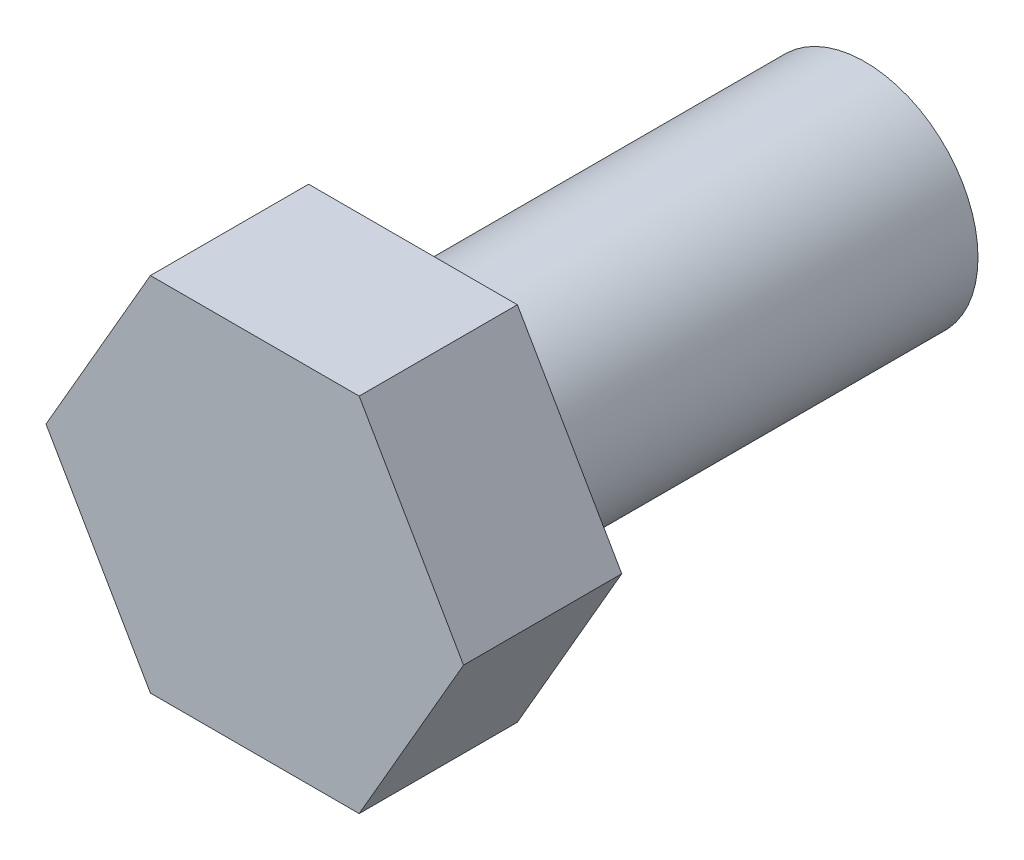
ISO-10303-21;
HEADER;
FILE_DESCRIPTION(('STEP AP214'),'2;1');
FILE_NAME('part.step','',(''),(''),'','','');
FILE_SCHEMA(('AUTOMOTIVE_DESIGN { 1 0 10303 214 1 1 1 1 }'));
ENDSEC;
DATA;
#1=APPLICATION_CONTEXT('core data for automotive mechanical design processes');
#2=APPLICATION_PROTOCOL_DEFINITION('international standard','automotive_design',2000,#1);
#3=PRODUCT_CONTEXT('',#1,'mechanical');
#4=PRODUCT('Part','Part','',(#3));
#5=PRODUCT_RELATED_PRODUCT_CATEGORY('part','',(#4));
#6=PRODUCT_DEFINITION_FORMATION('','',#4);
#7=PRODUCT_DEFINITION_CONTEXT('part definition',#1,'design');
#8=PRODUCT_DEFINITION('design','',#6,#7);
#9=PRODUCT_DEFINITION_SHAPE('','',#8);
#10=(LENGTH_UNIT() NAMED_UNIT(*) SI_UNIT(.MILLI.,.METRE.));
#11=(NAMED_UNIT(*) PLANE_ANGLE_UNIT() SI_UNIT($,.RADIAN.));
#12=(NAMED_UNIT(*) SI_UNIT($,.STERADIAN.) SOLID_ANGLE_UNIT());
#13=UNCERTAINTY_MEASURE_WITH_UNIT(LENGTH_MEASURE(1.E-05),#10,'distance_accuracy_value','');
#14=(GEOMETRIC_REPRESENTATION_CONTEXT(3) GLOBAL_UNCERTAINTY_ASSIGNED_CONTEXT((#13)) GLOBAL_UNIT_ASSIGNED_CONTEXT((#10,
#11,#12)) REPRESENTATION_CONTEXT('',''));
#15=CARTESIAN_POINT('',(0.,0.,0.));
#16=DIRECTION('',(0.,0.,1.));
#17=DIRECTION('',(1.,0.,0.));
#18=AXIS2_PLACEMENT_3D('',#15,#16,#17);
#19=CARTESIAN_POINT('',(0.,0.,-10.));
#20=DIRECTION('',(0.,0.,1.));
#21=DIRECTION('',(1.,0.,0.));
#22=AXIS2_PLACEMENT_3D('',#19,#20,#21);
#23=CYLINDRICAL_SURFACE('',#22,2.5);
#24=CARTESIAN_POINT('',(0.,0.,-10.));
#25=DIRECTION('',(0.,0.,1.));
#26=DIRECTION('',(1.,0.,0.));
#27=AXIS2_PLACEMENT_3D('',#24,#25,#26);
#28=CIRCLE('',#27,2.5);
#29=CARTESIAN_POINT('',(2.5,0.,-10.));
#30=VERTEX_POINT('',#29);
#31=EDGE_CURVE('E11',#30,#30,#28,.T.);
#32=ORIENTED_EDGE('',*,*,#31,.T.);
#33=EDGE_LOOP('',(#32));
#34=FACE_BOUND('',#33,.T.);
#35=CARTESIAN_POINT('',(0.,0.,0.));
#36=DIRECTION('',(0.,0.,1.));
#37=DIRECTION('',(1.,0.,0.));
#38=AXIS2_PLACEMENT_3D('',#35,#36,#37);
#39=CIRCLE('',#38,2.5);
#40=CARTESIAN_POINT('',(2.5,0.,0.));
#41=VERTEX_POINT('',#40);
#42=EDGE_CURVE('E39',#41,#41,#39,.T.);
#43=ORIENTED_EDGE('',*,*,#42,.F.);
#44=EDGE_LOOP('',(#43));
#45=FACE_BOUND('',#44,.T.);
#46=ADVANCED_FACE('F36',(#34,#45),#23,.T.);
#47=CARTESIAN_POINT('',(0.,0.,-10.));
#48=DIRECTION('',(0.,0.,1.));
#49=DIRECTION('',(1.,0.,0.));
#50=AXIS2_PLACEMENT_3D('',#47,#48,#49);
#51=PLANE('',#50);
#52=ORIENTED_EDGE('',*,*,#31,.F.);
#53=EDGE_LOOP('',(#52));
#54=FACE_BOUND('',#53,.T.);
#55=ADVANCED_FACE('F147',(#54),#51,.F.);
#56=CARTESIAN_POINT('',(2.3094010767585,4.,3.5));
#57=DIRECTION('',(0.,-1.,0.));
#58=DIRECTION('',(1.,0.,0.));
#59=AXIS2_PLACEMENT_3D('',#56,#57,#58);
#60=PLANE('',#59);
#61=DIRECTION('',(-1.,0.,0.));
#62=VECTOR('',#61,1.);
#63=CARTESIAN_POINT('',(2.3094010767585,4.,0.));
#64=LINE('',#63,#62);
#65=CARTESIAN_POINT('',(2.3094010767585,4.,0.));
#66=VERTEX_POINT('',#65);
#67=CARTESIAN_POINT('',(-2.3094010767585,4.,0.));
#68=VERTEX_POINT('',#67);
#69=EDGE_CURVE('E121',#66,#68,#64,.T.);
#70=ORIENTED_EDGE('',*,*,#69,.T.);
#71=DIRECTION('',(0.,0.,-1.));
#72=VECTOR('',#71,1.);
#73=CARTESIAN_POINT('',(-2.3094010767585,4.,3.5));
#74=LINE('',#73,#72);
#75=CARTESIAN_POINT('',(-2.3094010767585,4.,3.5));
#76=VERTEX_POINT('',#75);
#77=EDGE_CURVE('E138',#76,#68,#74,.T.);
#78=ORIENTED_EDGE('',*,*,#77,.F.);
#79=DIRECTION('',(-1.,0.,0.));
#80=VECTOR('',#79,1.);
#81=CARTESIAN_POINT('',(2.3094010767585,4.,3.5));
#82=LINE('',#81,#80);
#83=CARTESIAN_POINT('',(2.3094010767585,4.,3.5));
#84=VERTEX_POINT('',#83);
#85=EDGE_CURVE('E131',#84,#76,#82,.T.);
#86=ORIENTED_EDGE('',*,*,#85,.F.);
#87=DIRECTION('',(0.,0.,-1.));
#88=VECTOR('',#87,1.);
#89=CARTESIAN_POINT('',(2.3094010767585,4.,3.5));
#90=LINE('',#89,#88);
#91=EDGE_CURVE('E117',#84,#66,#90,.T.);
#92=ORIENTED_EDGE('',*,*,#91,.T.);
#93=EDGE_LOOP('',(#70,#78,#86,#92));
#94=FACE_BOUND('',#93,.T.);
#95=ADVANCED_FACE('F152',(#94),#60,.F.);
#96=CARTESIAN_POINT('',(-2.3094010767585,4.,3.5));
#97=DIRECTION('',(0.866025403784439,-0.5,0.));
#98=DIRECTION('',(0.5,0.866025403784439,0.));
#99=AXIS2_PLACEMENT_3D('',#96,#97,#98);
#100=PLANE('',#99);
#101=DIRECTION('',(-0.5,-0.866025403784439,0.));
#102=VECTOR('',#101,1.);
#103=CARTESIAN_POINT('',(-2.3094010767585,4.,0.));
#104=LINE('',#103,#102);
#105=CARTESIAN_POINT('',(-4.61880215351701,0.,0.));
#106=VERTEX_POINT('',#105);
#107=EDGE_CURVE('E124',#68,#106,#104,.T.);
#108=ORIENTED_EDGE('',*,*,#107,.T.);
#109=DIRECTION('',(0.,0.,-1.));
#110=VECTOR('',#109,1.);
#111=CARTESIAN_POINT('',(-4.61880215351701,0.,3.5));
#112=LINE('',#111,#110);
#113=CARTESIAN_POINT('',(-4.61880215351701,0.,3.5));
#114=VERTEX_POINT('',#113);
#115=EDGE_CURVE('E135',#114,#106,#112,.T.);
#116=ORIENTED_EDGE('',*,*,#115,.F.);
#117=DIRECTION('',(-0.5,-0.866025403784439,0.));
#118=VECTOR('',#117,1.);
#119=CARTESIAN_POINT('',(-2.3094010767585,4.,3.5));
#120=LINE('',#119,#118);
#121=EDGE_CURVE('E90',#76,#114,#120,.T.);
#122=ORIENTED_EDGE('',*,*,#121,.F.);
#123=ORIENTED_EDGE('',*,*,#77,.T.);
#124=EDGE_LOOP('',(#108,#116,#122,#123));
#125=FACE_BOUND('',#124,.T.);
#126=ADVANCED_FACE('F158',(#125),#100,.F.);
#127=CARTESIAN_POINT('',(-4.61880215351701,0.,3.5));
#128=DIRECTION('',(0.866025403784439,0.5,0.));
#129=DIRECTION('',(-0.5,0.866025403784439,0.));
#130=AXIS2_PLACEMENT_3D('',#127,#128,#129);
#131=PLANE('',#130);
#132=DIRECTION('',(0.5,-0.866025403784439,0.));
#133=VECTOR('',#132,1.);
#134=CARTESIAN_POINT('',(-4.61880215351701,0.,0.));
#135=LINE('',#134,#133);
#136=CARTESIAN_POINT('',(-2.30940107675851,-4.,0.));
#137=VERTEX_POINT('',#136);
#138=EDGE_CURVE('E126',#106,#137,#135,.T.);
#139=ORIENTED_EDGE('',*,*,#138,.T.);
#140=DIRECTION('',(0.,0.,-1.));
#141=VECTOR('',#140,1.);
#142=CARTESIAN_POINT('',(-2.30940107675851,-4.,3.5));
#143=LINE('',#142,#141);
#144=CARTESIAN_POINT('',(-2.30940107675851,-4.,3.5));
#145=VERTEX_POINT('',#144);
#146=EDGE_CURVE('E112',#145,#137,#143,.T.);
#147=ORIENTED_EDGE('',*,*,#146,.F.);
#148=DIRECTION('',(0.5,-0.866025403784439,0.));
#149=VECTOR('',#148,1.);
#150=CARTESIAN_POINT('',(-4.61880215351701,0.,3.5));
#151=LINE('',#150,#149);
#152=EDGE_CURVE('E103',#114,#145,#151,.T.);
#153=ORIENTED_EDGE('',*,*,#152,.F.);
#154=ORIENTED_EDGE('',*,*,#115,.T.);
#155=EDGE_LOOP('',(#139,#147,#153,#154));
#156=FACE_BOUND('',#155,.T.);
#157=ADVANCED_FACE('F164',(#156),#131,.F.);
#158=CARTESIAN_POINT('',(-2.30940107675851,-4.,3.5));
#159=DIRECTION('',(0.,1.,0.));
#160=DIRECTION('',(0.,0.,1.));
#161=AXIS2_PLACEMENT_3D('',#158,#159,#160);
#162=PLANE('',#161);
#163=DIRECTION('',(1.,0.,0.));
#164=VECTOR('',#163,1.);
#165=CARTESIAN_POINT('',(-2.30940107675851,-4.,0.));
#166=LINE('',#165,#164);
#167=CARTESIAN_POINT('',(2.3094010767585,-4.,0.));
#168=VERTEX_POINT('',#167);
#169=EDGE_CURVE('E111',#137,#168,#166,.T.);
#170=ORIENTED_EDGE('',*,*,#169,.T.);
#171=DIRECTION('',(0.,0.,-1.));
#172=VECTOR('',#171,1.);
#173=CARTESIAN_POINT('',(2.3094010767585,-4.,3.5));
#174=LINE('',#173,#172);
#175=CARTESIAN_POINT('',(2.3094010767585,-4.,3.5));
#176=VERTEX_POINT('',#175);
#177=EDGE_CURVE('E108',#176,#168,#174,.T.);
#178=ORIENTED_EDGE('',*,*,#177,.F.);
#179=DIRECTION('',(1.,0.,0.));
#180=VECTOR('',#179,1.);
#181=CARTESIAN_POINT('',(-2.30940107675851,-4.,3.5));
#182=LINE('',#181,#180);
#183=EDGE_CURVE('E97',#145,#176,#182,.T.);
#184=ORIENTED_EDGE('',*,*,#183,.F.);
#185=ORIENTED_EDGE('',*,*,#146,.T.);
#186=EDGE_LOOP('',(#170,#178,#184,#185));
#187=FACE_BOUND('',#186,.T.);
#188=ADVANCED_FACE('F109',(#187),#162,.F.);
#189=CARTESIAN_POINT('',(2.3094010767585,-4.,3.5));
#190=DIRECTION('',(-0.866025403784439,0.5,0.));
#191=DIRECTION('',(-0.5,-0.866025403784439,0.));
#192=AXIS2_PLACEMENT_3D('',#189,#190,#191);
#193=PLANE('',#192);
#194=DIRECTION('',(0.5,0.866025403784439,0.));
#195=VECTOR('',#194,1.);
#196=CARTESIAN_POINT('',(2.3094010767585,-4.,0.));
#197=LINE('',#196,#195);
#198=CARTESIAN_POINT('',(4.618802153517,0.,0.));
#199=VERTEX_POINT('',#198);
#200=EDGE_CURVE('E75',#168,#199,#197,.T.);
#201=ORIENTED_EDGE('',*,*,#200,.T.);
#202=DIRECTION('',(0.,0.,-1.));
#203=VECTOR('',#202,1.);
#204=CARTESIAN_POINT('',(4.618802153517,0.,3.5));
#205=LINE('',#204,#203);
#206=CARTESIAN_POINT('',(4.618802153517,0.,3.5));
#207=VERTEX_POINT('',#206);
#208=EDGE_CURVE('E113',#207,#199,#205,.T.);
#209=ORIENTED_EDGE('',*,*,#208,.F.);
#210=DIRECTION('',(0.5,0.866025403784439,0.));
#211=VECTOR('',#210,1.);
#212=CARTESIAN_POINT('',(2.3094010767585,-4.,3.5));
#213=LINE('',#212,#211);
#214=EDGE_CURVE('E101',#176,#207,#213,.T.);
#215=ORIENTED_EDGE('',*,*,#214,.F.);
#216=ORIENTED_EDGE('',*,*,#177,.T.);
#217=EDGE_LOOP('',(#201,#209,#215,#216));
#218=FACE_BOUND('',#217,.T.);
#219=ADVANCED_FACE('F115',(#218),#193,.F.);
#220=CARTESIAN_POINT('',(4.618802153517,0.,3.5));
#221=DIRECTION('',(-0.866025403784439,-0.5,0.));
#222=DIRECTION('',(0.5,-0.866025403784439,0.));
#223=AXIS2_PLACEMENT_3D('',#220,#221,#222);
#224=PLANE('',#223);
#225=DIRECTION('',(-0.5,0.866025403784439,0.));
#226=VECTOR('',#225,1.);
#227=CARTESIAN_POINT('',(4.618802153517,0.,0.));
#228=LINE('',#227,#226);
#229=EDGE_CURVE('E81',#199,#66,#228,.T.);
#230=ORIENTED_EDGE('',*,*,#229,.T.);
#231=ORIENTED_EDGE('',*,*,#91,.F.);
#232=DIRECTION('',(-0.5,0.866025403784439,0.));
#233=VECTOR('',#232,1.);
#234=CARTESIAN_POINT('',(4.618802153517,0.,3.5));
#235=LINE('',#234,#233);
#236=EDGE_CURVE('E52',#207,#84,#235,.T.);
#237=ORIENTED_EDGE('',*,*,#236,.F.);
#238=ORIENTED_EDGE('',*,*,#208,.T.);
#239=EDGE_LOOP('',(#230,#231,#237,#238));
#240=FACE_BOUND('',#239,.T.);
#241=ADVANCED_FACE('F172',(#240),#224,.F.);
#242=CARTESIAN_POINT('',(6.9282032302755,4.,3.5));
#243=DIRECTION('',(0.,0.,-1.));
#244=DIRECTION('',(-1.,0.,0.));
#245=AXIS2_PLACEMENT_3D('',#242,#243,#244);
#246=PLANE('',#245);
#247=ORIENTED_EDGE('',*,*,#85,.T.);
#248=ORIENTED_EDGE('',*,*,#121,.T.);
#249=ORIENTED_EDGE('',*,*,#152,.T.);
#250=ORIENTED_EDGE('',*,*,#183,.T.);
#251=ORIENTED_EDGE('',*,*,#214,.T.);
#252=ORIENTED_EDGE('',*,*,#236,.T.);
#253=EDGE_LOOP('',(#247,#248,#249,#250,#251,#252));
#254=FACE_BOUND('',#253,.T.);
#255=ADVANCED_FACE('F99',(#254),#246,.F.);
#256=CARTESIAN_POINT('',(6.9282032302755,4.,0.));
#257=DIRECTION('',(0.,0.,-1.));
#258=DIRECTION('',(-1.,0.,0.));
#259=AXIS2_PLACEMENT_3D('',#256,#257,#258);
#260=PLANE('',#259);
#261=ORIENTED_EDGE('',*,*,#42,.T.);
#262=EDGE_LOOP('',(#261));
#263=FACE_BOUND('',#262,.T.);
#264=ORIENTED_EDGE('',*,*,#69,.F.);
#265=ORIENTED_EDGE('',*,*,#229,.F.);
#266=ORIENTED_EDGE('',*,*,#200,.F.);
#267=ORIENTED_EDGE('',*,*,#169,.F.);
#268=ORIENTED_EDGE('',*,*,#138,.F.);
#269=ORIENTED_EDGE('',*,*,#107,.F.);
#270=EDGE_LOOP('',(#264,#265,#266,#267,#268,#269));
#271=FACE_BOUND('',#270,.T.);
#272=ADVANCED_FACE('F143',(#263,#271),#260,.T.);
#273=CLOSED_SHELL('',(#46,#55,#95,#126,#157,#188,#219,#241,#255,#272));
#274=MANIFOLD_SOLID_BREP('B2',#273);
#275=ADVANCED_BREP_SHAPE_REPRESENTATION('',(#18,#274),#14);
#276=SHAPE_DEFINITION_REPRESENTATION(#9,#275);
ENDSEC;
END-ISO-10303-21;
